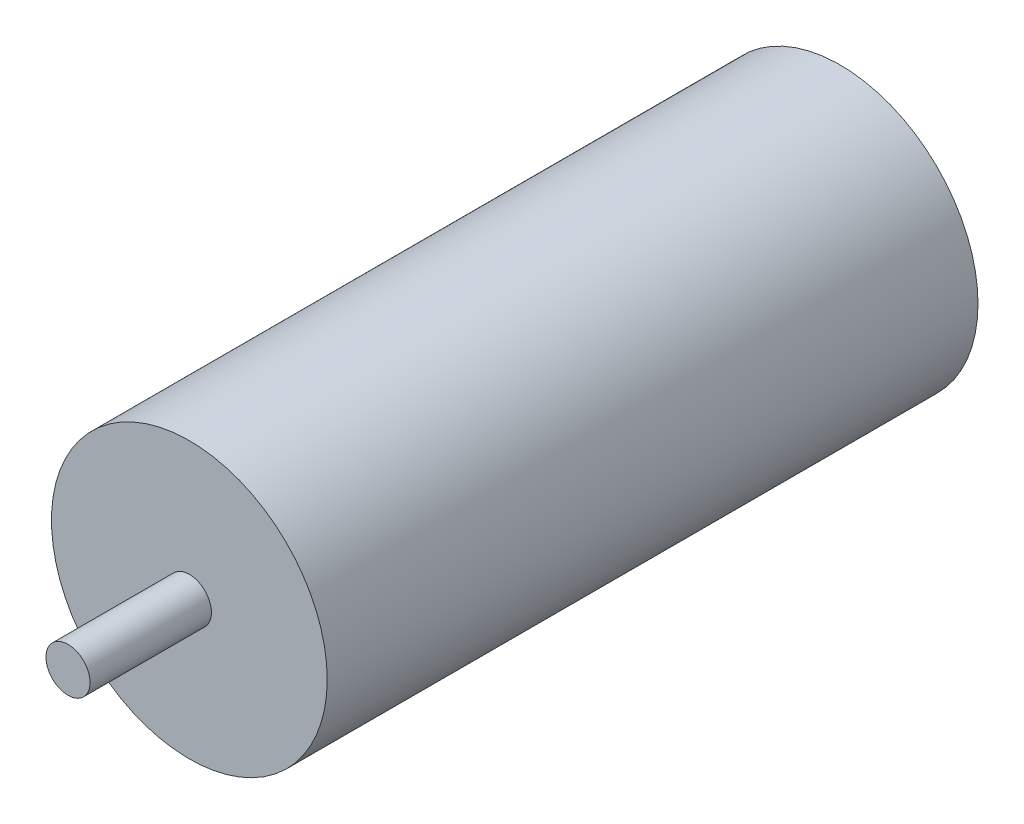
ISO-10303-21;
HEADER;
FILE_DESCRIPTION(('STEP AP214'),'2;1');
FILE_NAME('part.step','',(''),(''),'','','');
FILE_SCHEMA(('AUTOMOTIVE_DESIGN { 1 0 10303 214 1 1 1 1 }'));
ENDSEC;
DATA;
#1=APPLICATION_CONTEXT('core data for automotive mechanical design processes');
#2=APPLICATION_PROTOCOL_DEFINITION('international standard','automotive_design',2000,#1);
#3=PRODUCT_CONTEXT('',#1,'mechanical');
#4=PRODUCT('Part','Part','',(#3));
#5=PRODUCT_RELATED_PRODUCT_CATEGORY('part','',(#4));
#6=PRODUCT_DEFINITION_FORMATION('','',#4);
#7=PRODUCT_DEFINITION_CONTEXT('part definition',#1,'design');
#8=PRODUCT_DEFINITION('design','',#6,#7);
#9=PRODUCT_DEFINITION_SHAPE('','',#8);
#10=(LENGTH_UNIT() NAMED_UNIT(*) SI_UNIT(.MILLI.,.METRE.));
#11=(NAMED_UNIT(*) PLANE_ANGLE_UNIT() SI_UNIT($,.RADIAN.));
#12=(NAMED_UNIT(*) SI_UNIT($,.STERADIAN.) SOLID_ANGLE_UNIT());
#13=UNCERTAINTY_MEASURE_WITH_UNIT(LENGTH_MEASURE(1.E-05),#10,'distance_accuracy_value','');
#14=(GEOMETRIC_REPRESENTATION_CONTEXT(3) GLOBAL_UNCERTAINTY_ASSIGNED_CONTEXT((#13)) GLOBAL_UNIT_ASSIGNED_CONTEXT((#10,
#11,#12)) REPRESENTATION_CONTEXT('',''));
#15=CARTESIAN_POINT('',(0.,0.,0.));
#16=DIRECTION('',(0.,0.,1.));
#17=DIRECTION('',(1.,0.,0.));
#18=AXIS2_PLACEMENT_3D('',#15,#16,#17);
#19=CARTESIAN_POINT('',(0.,0.,11.));
#20=DIRECTION('',(0.,0.,-1.));
#21=DIRECTION('',(-1.,0.,0.));
#22=AXIS2_PLACEMENT_3D('',#19,#20,#21);
#23=CYLINDRICAL_SURFACE('',#22,2.);
#24=CARTESIAN_POINT('',(0.,0.,11.));
#25=DIRECTION('',(0.,0.,1.));
#26=DIRECTION('',(1.,0.,0.));
#27=AXIS2_PLACEMENT_3D('',#24,#25,#26);
#28=CIRCLE('',#27,2.);
#29=CARTESIAN_POINT('',(2.,0.,11.));
#30=VERTEX_POINT('',#29);
#31=EDGE_CURVE('E10',#30,#30,#28,.T.);
#32=ORIENTED_EDGE('',*,*,#31,.F.);
#33=EDGE_LOOP('',(#32));
#34=FACE_BOUND('',#33,.T.);
#35=CARTESIAN_POINT('',(0.,0.,0.));
#36=DIRECTION('',(0.,0.,1.));
#37=DIRECTION('',(1.,0.,0.));
#38=AXIS2_PLACEMENT_3D('',#35,#36,#37);
#39=CIRCLE('',#38,2.);
#40=CARTESIAN_POINT('',(2.,0.,0.));
#41=VERTEX_POINT('',#40);
#42=EDGE_CURVE('E40',#41,#41,#39,.T.);
#43=ORIENTED_EDGE('',*,*,#42,.T.);
#44=EDGE_LOOP('',(#43));
#45=FACE_BOUND('',#44,.T.);
#46=ADVANCED_FACE('F37',(#34,#45),#23,.T.);
#47=CARTESIAN_POINT('',(0.,0.,11.));
#48=DIRECTION('',(0.,0.,1.));
#49=DIRECTION('',(1.,0.,0.));
#50=AXIS2_PLACEMENT_3D('',#47,#48,#49);
#51=PLANE('',#50);
#52=ORIENTED_EDGE('',*,*,#31,.T.);
#53=EDGE_LOOP('',(#52));
#54=FACE_BOUND('',#53,.T.);
#55=ADVANCED_FACE('F64',(#54),#51,.T.);
#56=CARTESIAN_POINT('',(0.,0.,-59.));
#57=DIRECTION('',(0.,0.,1.));
#58=DIRECTION('',(1.,0.,0.));
#59=AXIS2_PLACEMENT_3D('',#56,#57,#58);
#60=CYLINDRICAL_SURFACE('',#59,12.5);
#61=CARTESIAN_POINT('',(0.,0.,-59.));
#62=DIRECTION('',(0.,0.,-1.));
#63=DIRECTION('',(-1.,0.,0.));
#64=AXIS2_PLACEMENT_3D('',#61,#62,#63);
#65=CIRCLE('',#64,12.5);
#66=CARTESIAN_POINT('',(12.5,0.,-59.));
#67=VERTEX_POINT('',#66);
#68=EDGE_CURVE('E49',#67,#67,#65,.T.);
#69=CARTESIAN_POINT('',(0.,0.,0.));
#70=DIRECTION('',(0.,0.,-1.));
#71=DIRECTION('',(-1.,0.,0.));
#72=AXIS2_PLACEMENT_3D('',#69,#70,#71);
#73=CIRCLE('',#72,12.5);
#74=CARTESIAN_POINT('',(12.5,0.,0.));
#75=VERTEX_POINT('',#74);
#76=EDGE_CURVE('E51',#75,#75,#73,.T.);
#77=CARTESIAN_POINT('',(12.5,0.,-59.));
#78=CARTESIAN_POINT('',(12.5,0.,-58.3854166666667));
#79=CARTESIAN_POINT('',(12.5,0.,-57.7708333333333));
#80=CARTESIAN_POINT('',(12.5,0.,-56.5416666666667));
#81=CARTESIAN_POINT('',(12.5,0.,-55.9270833333333));
#82=CARTESIAN_POINT('',(12.5,0.,-54.6979166666667));
#83=CARTESIAN_POINT('',(12.5,0.,-54.0833333333333));
#84=CARTESIAN_POINT('',(12.5,0.,-52.8541666666667));
#85=CARTESIAN_POINT('',(12.5,0.,-52.2395833333333));
#86=CARTESIAN_POINT('',(12.5,0.,-51.0104166666667));
#87=CARTESIAN_POINT('',(12.5,0.,-50.3958333333333));
#88=CARTESIAN_POINT('',(12.5,0.,-49.1666666666667));
#89=CARTESIAN_POINT('',(12.5,0.,-48.5520833333333));
#90=CARTESIAN_POINT('',(12.5,0.,-47.3229166666667));
#91=CARTESIAN_POINT('',(12.5,0.,-46.7083333333333));
#92=CARTESIAN_POINT('',(12.5,0.,-45.4791666666667));
#93=CARTESIAN_POINT('',(12.5,0.,-44.8645833333333));
#94=CARTESIAN_POINT('',(12.5,0.,-43.6354166666667));
#95=CARTESIAN_POINT('',(12.5,0.,-43.0208333333333));
#96=CARTESIAN_POINT('',(12.5,0.,-41.7916666666667));
#97=CARTESIAN_POINT('',(12.5,0.,-41.1770833333333));
#98=CARTESIAN_POINT('',(12.5,0.,-39.9479166666667));
#99=CARTESIAN_POINT('',(12.5,0.,-39.3333333333333));
#100=CARTESIAN_POINT('',(12.5,0.,-38.1041666666667));
#101=CARTESIAN_POINT('',(12.5,0.,-37.4895833333333));
#102=CARTESIAN_POINT('',(12.5,0.,-36.2604166666667));
#103=CARTESIAN_POINT('',(12.5,0.,-35.6458333333333));
#104=CARTESIAN_POINT('',(12.5,0.,-34.4166666666667));
#105=CARTESIAN_POINT('',(12.5,0.,-33.8020833333333));
#106=CARTESIAN_POINT('',(12.5,0.,-32.5729166666667));
#107=CARTESIAN_POINT('',(12.5,0.,-31.9583333333333));
#108=CARTESIAN_POINT('',(12.5,0.,-30.7291666666667));
#109=CARTESIAN_POINT('',(12.5,0.,-30.1145833333333));
#110=CARTESIAN_POINT('',(12.5,0.,-28.8854166666667));
#111=CARTESIAN_POINT('',(12.5,0.,-28.2708333333333));
#112=CARTESIAN_POINT('',(12.5,0.,-27.0416666666667));
#113=CARTESIAN_POINT('',(12.5,0.,-26.4270833333333));
#114=CARTESIAN_POINT('',(12.5,0.,-25.1979166666667));
#115=CARTESIAN_POINT('',(12.5,0.,-24.5833333333333));
#116=CARTESIAN_POINT('',(12.5,0.,-23.3541666666667));
#117=CARTESIAN_POINT('',(12.5,0.,-22.7395833333333));
#118=CARTESIAN_POINT('',(12.5,0.,-21.5104166666667));
#119=CARTESIAN_POINT('',(12.5,0.,-20.8958333333333));
#120=CARTESIAN_POINT('',(12.5,0.,-19.6666666666667));
#121=CARTESIAN_POINT('',(12.5,0.,-19.0520833333333));
#122=CARTESIAN_POINT('',(12.5,0.,-17.8229166666667));
#123=CARTESIAN_POINT('',(12.5,0.,-17.2083333333333));
#124=CARTESIAN_POINT('',(12.5,0.,-15.9791666666667));
#125=CARTESIAN_POINT('',(12.5,0.,-15.3645833333333));
#126=CARTESIAN_POINT('',(12.5,0.,-14.1354166666667));
#127=CARTESIAN_POINT('',(12.5,0.,-13.5208333333333));
#128=CARTESIAN_POINT('',(12.5,0.,-12.2916666666667));
#129=CARTESIAN_POINT('',(12.5,0.,-11.6770833333333));
#130=CARTESIAN_POINT('',(12.5,0.,-10.4479166666667));
#131=CARTESIAN_POINT('',(12.5,0.,-9.83333333333334));
#132=CARTESIAN_POINT('',(12.5,0.,-8.60416666666667));
#133=CARTESIAN_POINT('',(12.5,0.,-7.98958333333333));
#134=CARTESIAN_POINT('',(12.5,0.,-6.76041666666667));
#135=CARTESIAN_POINT('',(12.5,0.,-6.14583333333333));
#136=CARTESIAN_POINT('',(12.5,0.,-4.91666666666667));
#137=CARTESIAN_POINT('',(12.5,0.,-4.30208333333334));
#138=CARTESIAN_POINT('',(12.5,0.,-3.07291666666667));
#139=CARTESIAN_POINT('',(12.5,0.,-2.45833333333333));
#140=CARTESIAN_POINT('',(12.5,0.,-1.22916666666667));
#141=CARTESIAN_POINT('',(12.5,0.,-0.614583333333332));
#142=CARTESIAN_POINT('',(12.5,0.,0.));
#143=B_SPLINE_CURVE_WITH_KNOTS('',3,(#77,#78,#79,#80,#81,#82,#83,#84,#85,#86,#87,#88,#89,#90,
#91,#92,#93,#94,#95,#96,#97,#98,#99,#100,#101,#102,#103,#104,#105,#106,#107,#108,#109,#110,#111,
#112,#113,#114,#115,#116,#117,#118,#119,#120,#121,#122,#123,#124,#125,#126,#127,#128,#129,#130,
#131,#132,#133,#134,#135,#136,#137,#138,#139,#140,#141,#142),.UNSPECIFIED.,.F.,.F.,(4,2,2,2,2,2,
2,2,2,2,2,2,2,2,2,2,2,2,2,2,2,2,2,2,2,2,2,2,2,2,2,2,4),(0.,1.84375000000001,3.6875,5.53125,
7.37500000000001,9.21875000000001,11.0625,12.90625,14.75,16.59375,18.4375,20.28125,22.125,
23.96875,25.8125,27.65625,29.5,31.34375,33.1875,35.03125,36.875,38.71875,40.5625,42.40625,44.25,
46.09375,47.9375,49.78125,51.625,53.46875,55.3125,57.15625,59.),.UNSPECIFIED.);
#144=EDGE_CURVE('BSEAM61',#67,#75,#143,.T.);
#145=ORIENTED_EDGE('',*,*,#68,.F.);
#146=ORIENTED_EDGE('',*,*,#76,.T.);
#147=ORIENTED_EDGE('',*,*,#144,.T.);
#148=ORIENTED_EDGE('',*,*,#144,.F.);
#149=EDGE_LOOP('',(#145,#147,#146,#148));
#150=FACE_BOUND('',#149,.T.);
#151=ADVANCED_FACE('F61',(#150),#60,.T.);
#152=CARTESIAN_POINT('',(0.,0.,-59.));
#153=DIRECTION('',(0.,0.,-1.));
#154=DIRECTION('',(-1.,0.,0.));
#155=AXIS2_PLACEMENT_3D('',#152,#153,#154);
#156=PLANE('',#155);
#157=ORIENTED_EDGE('',*,*,#68,.T.);
#158=EDGE_LOOP('',(#157));
#159=FACE_BOUND('',#158,.T.);
#160=ADVANCED_FACE('F59',(#159),#156,.T.);
#161=CARTESIAN_POINT('',(0.,0.,0.));
#162=DIRECTION('',(0.,0.,-1.));
#163=DIRECTION('',(-1.,0.,0.));
#164=AXIS2_PLACEMENT_3D('',#161,#162,#163);
#165=PLANE('',#164);
#166=ORIENTED_EDGE('',*,*,#42,.F.);
#167=EDGE_LOOP('',(#166));
#168=FACE_BOUND('',#167,.T.);
#169=ORIENTED_EDGE('',*,*,#76,.F.);
#170=EDGE_LOOP('',(#169));
#171=FACE_BOUND('',#170,.T.);
#172=ADVANCED_FACE('F68',(#168,#171),#165,.F.);
#173=CLOSED_SHELL('',(#46,#55,#151,#160,#172));
#174=MANIFOLD_SOLID_BREP('B2',#173);
#175=ADVANCED_BREP_SHAPE_REPRESENTATION('',(#18,#174),#14);
#176=SHAPE_DEFINITION_REPRESENTATION(#9,#175);
ENDSEC;
END-ISO-10303-21;
